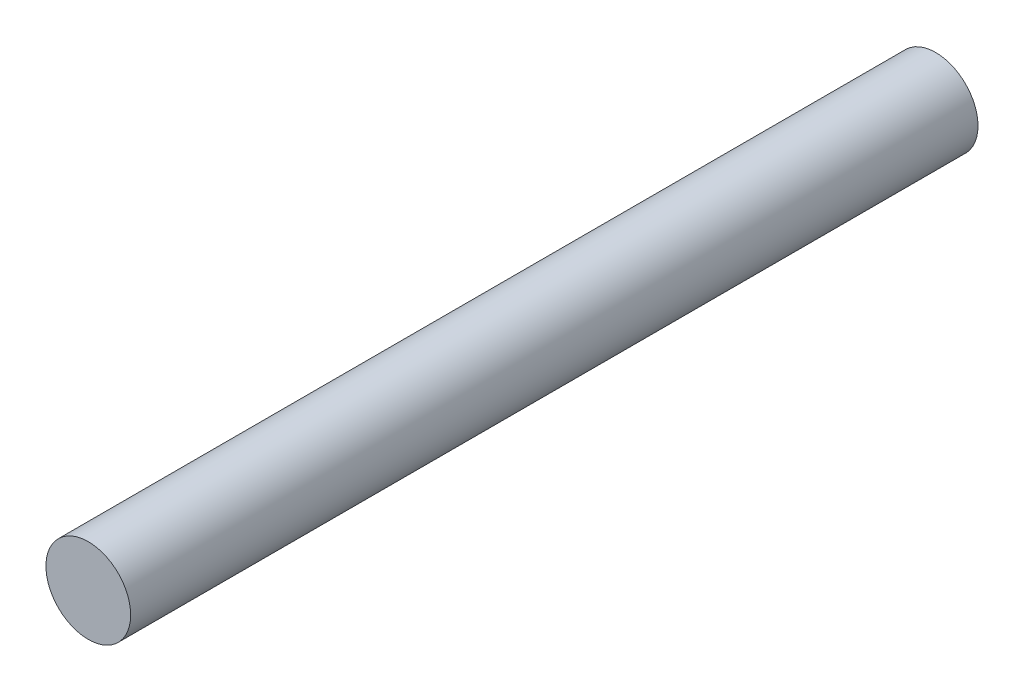
ISO-10303-21;
HEADER;
FILE_DESCRIPTION(('STEP AP214'),'2;1');
FILE_NAME('part.step','',(''),(''),'','','');
FILE_SCHEMA(('AUTOMOTIVE_DESIGN { 1 0 10303 214 1 1 1 1 }'));
ENDSEC;
DATA;
#1=APPLICATION_CONTEXT('core data for automotive mechanical design processes');
#2=APPLICATION_PROTOCOL_DEFINITION('international standard','automotive_design',2000,#1);
#3=PRODUCT_CONTEXT('',#1,'mechanical');
#4=PRODUCT('Part','Part','',(#3));
#5=PRODUCT_RELATED_PRODUCT_CATEGORY('part','',(#4));
#6=PRODUCT_DEFINITION_FORMATION('','',#4);
#7=PRODUCT_DEFINITION_CONTEXT('part definition',#1,'design');
#8=PRODUCT_DEFINITION('design','',#6,#7);
#9=PRODUCT_DEFINITION_SHAPE('','',#8);
#10=(LENGTH_UNIT() NAMED_UNIT(*) SI_UNIT(.MILLI.,.METRE.));
#11=(NAMED_UNIT(*) PLANE_ANGLE_UNIT() SI_UNIT($,.RADIAN.));
#12=(NAMED_UNIT(*) SI_UNIT($,.STERADIAN.) SOLID_ANGLE_UNIT());
#13=UNCERTAINTY_MEASURE_WITH_UNIT(LENGTH_MEASURE(1.E-05),#10,'distance_accuracy_value','');
#14=(GEOMETRIC_REPRESENTATION_CONTEXT(3) GLOBAL_UNCERTAINTY_ASSIGNED_CONTEXT((#13)) GLOBAL_UNIT_ASSIGNED_CONTEXT((#10,
#11,#12)) REPRESENTATION_CONTEXT('',''));
#15=CARTESIAN_POINT('',(0.,0.,0.));
#16=DIRECTION('',(0.,0.,1.));
#17=DIRECTION('',(1.,0.,0.));
#18=AXIS2_PLACEMENT_3D('',#15,#16,#17);
#19=CARTESIAN_POINT('',(0.,0.,500.));
#20=DIRECTION('',(0.,0.,-1.));
#21=DIRECTION('',(-1.,0.,0.));
#22=AXIS2_PLACEMENT_3D('',#19,#20,#21);
#23=CYLINDRICAL_SURFACE('',#22,25.);
#24=CARTESIAN_POINT('',(0.,0.,500.));
#25=DIRECTION('',(0.,0.,1.));
#26=DIRECTION('',(1.,0.,0.));
#27=AXIS2_PLACEMENT_3D('',#24,#25,#26);
#28=CIRCLE('',#27,25.);
#29=CARTESIAN_POINT('',(25.,0.,500.));
#30=VERTEX_POINT('',#29);
#31=EDGE_CURVE('E10',#30,#30,#28,.T.);
#32=ORIENTED_EDGE('',*,*,#31,.F.);
#33=EDGE_LOOP('',(#32));
#34=FACE_BOUND('',#33,.T.);
#35=CARTESIAN_POINT('',(0.,0.,0.));
#36=DIRECTION('',(0.,0.,1.));
#37=DIRECTION('',(1.,0.,0.));
#38=AXIS2_PLACEMENT_3D('',#35,#36,#37);
#39=CIRCLE('',#38,25.);
#40=CARTESIAN_POINT('',(25.,0.,0.));
#41=VERTEX_POINT('',#40);
#42=EDGE_CURVE('E33',#41,#41,#39,.T.);
#43=ORIENTED_EDGE('',*,*,#42,.T.);
#44=EDGE_LOOP('',(#43));
#45=FACE_BOUND('',#44,.T.);
#46=ADVANCED_FACE('F30',(#34,#45),#23,.T.);
#47=CARTESIAN_POINT('',(0.,0.,500.));
#48=DIRECTION('',(0.,0.,1.));
#49=DIRECTION('',(1.,0.,0.));
#50=AXIS2_PLACEMENT_3D('',#47,#48,#49);
#51=PLANE('',#50);
#52=ORIENTED_EDGE('',*,*,#31,.T.);
#53=EDGE_LOOP('',(#52));
#54=FACE_BOUND('',#53,.T.);
#55=ADVANCED_FACE('F45',(#54),#51,.T.);
#56=CARTESIAN_POINT('',(0.,0.,0.));
#57=DIRECTION('',(0.,0.,1.));
#58=DIRECTION('',(1.,0.,0.));
#59=AXIS2_PLACEMENT_3D('',#56,#57,#58);
#60=PLANE('',#59);
#61=ORIENTED_EDGE('',*,*,#42,.F.);
#62=EDGE_LOOP('',(#61));
#63=FACE_BOUND('',#62,.T.);
#64=ADVANCED_FACE('F43',(#63),#60,.F.);
#65=CLOSED_SHELL('',(#46,#55,#64));
#66=MANIFOLD_SOLID_BREP('B2',#65);
#67=ADVANCED_BREP_SHAPE_REPRESENTATION('',(#18,#66),#14);
#68=SHAPE_DEFINITION_REPRESENTATION(#9,#67);
ENDSEC;
END-ISO-10303-21;
